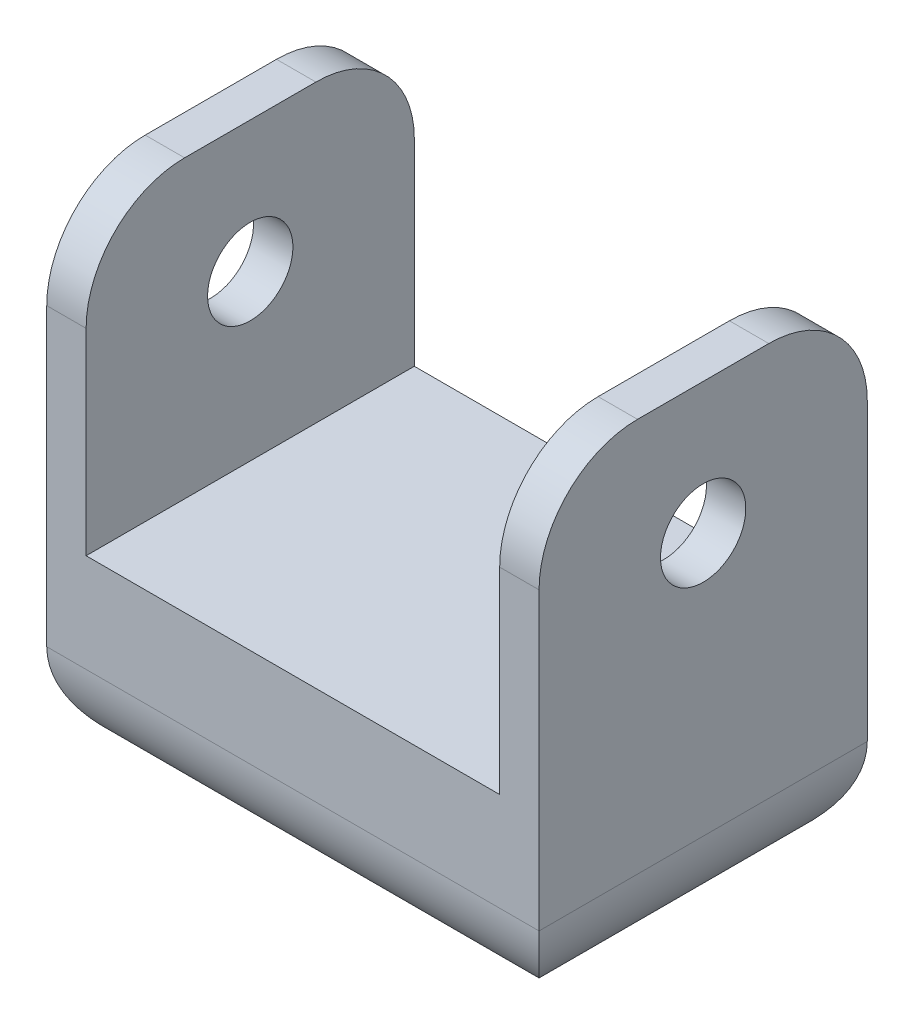
ISO-10303-21;
HEADER;
FILE_DESCRIPTION(('STEP AP214'),'2;1');
FILE_NAME('part.step','',(''),(''),'','','');
FILE_SCHEMA(('AUTOMOTIVE_DESIGN { 1 0 10303 214 1 1 1 1 }'));
ENDSEC;
DATA;
#1=APPLICATION_CONTEXT('core data for automotive mechanical design processes');
#2=APPLICATION_PROTOCOL_DEFINITION('international standard','automotive_design',2000,#1);
#3=PRODUCT_CONTEXT('',#1,'mechanical');
#4=PRODUCT('Part','Part','',(#3));
#5=PRODUCT_RELATED_PRODUCT_CATEGORY('part','',(#4));
#6=PRODUCT_DEFINITION_FORMATION('','',#4);
#7=PRODUCT_DEFINITION_CONTEXT('part definition',#1,'design');
#8=PRODUCT_DEFINITION('design','',#6,#7);
#9=PRODUCT_DEFINITION_SHAPE('','',#8);
#10=(LENGTH_UNIT() NAMED_UNIT(*) SI_UNIT(.MILLI.,.METRE.));
#11=(NAMED_UNIT(*) PLANE_ANGLE_UNIT() SI_UNIT($,.RADIAN.));
#12=(NAMED_UNIT(*) SI_UNIT($,.STERADIAN.) SOLID_ANGLE_UNIT());
#13=UNCERTAINTY_MEASURE_WITH_UNIT(LENGTH_MEASURE(1.E-05),#10,'distance_accuracy_value','');
#14=(GEOMETRIC_REPRESENTATION_CONTEXT(3) GLOBAL_UNCERTAINTY_ASSIGNED_CONTEXT((#13)) GLOBAL_UNIT_ASSIGNED_CONTEXT((#10,
#11,#12)) REPRESENTATION_CONTEXT('',''));
#15=CARTESIAN_POINT('',(0.,0.,0.));
#16=DIRECTION('',(0.,0.,1.));
#17=DIRECTION('',(1.,0.,0.));
#18=AXIS2_PLACEMENT_3D('',#15,#16,#17);
#19=CARTESIAN_POINT('',(0.,25.4,0.));
#20=DIRECTION('',(0.,1.,0.));
#21=DIRECTION('',(0.,0.,1.));
#22=AXIS2_PLACEMENT_3D('',#19,#20,#21);
#23=PLANE('',#22);
#24=DIRECTION('',(0.,0.,1.));
#25=VECTOR('',#24,1.);
#26=CARTESIAN_POINT('',(-19.05,25.4,-12.7));
#27=LINE('',#26,#25);
#28=CARTESIAN_POINT('',(-19.05,25.4,-5.08));
#29=VERTEX_POINT('',#28);
#30=CARTESIAN_POINT('',(-19.05,25.4,5.07999999999999));
#31=VERTEX_POINT('',#30);
#32=EDGE_CURVE('E187',#29,#31,#27,.T.);
#33=ORIENTED_EDGE('',*,*,#32,.T.);
#34=DIRECTION('',(1.,0.,0.));
#35=VECTOR('',#34,1.);
#36=CARTESIAN_POINT('',(-16.002,25.4,5.08));
#37=LINE('',#36,#35);
#38=CARTESIAN_POINT('',(-16.002,25.4,5.07999999999999));
#39=VERTEX_POINT('',#38);
#40=EDGE_CURVE('E227',#31,#39,#37,.T.);
#41=ORIENTED_EDGE('',*,*,#40,.T.);
#42=DIRECTION('',(0.,0.,1.));
#43=VECTOR('',#42,1.);
#44=CARTESIAN_POINT('',(-16.002,25.4,-12.7));
#45=LINE('',#44,#43);
#46=CARTESIAN_POINT('',(-16.002,25.4,-5.08));
#47=VERTEX_POINT('',#46);
#48=EDGE_CURVE('E173',#47,#39,#45,.T.);
#49=ORIENTED_EDGE('',*,*,#48,.F.);
#50=DIRECTION('',(-1.,0.,0.));
#51=VECTOR('',#50,1.);
#52=CARTESIAN_POINT('',(-19.05,25.4,-5.08));
#53=LINE('',#52,#51);
#54=EDGE_CURVE('E224',#47,#29,#53,.T.);
#55=ORIENTED_EDGE('',*,*,#54,.T.);
#56=EDGE_LOOP('',(#33,#41,#49,#55));
#57=FACE_BOUND('',#56,.T.);
#58=ADVANCED_FACE('F37',(#57),#23,.T.);
#59=CARTESIAN_POINT('',(19.05,25.4,-12.7));
#60=DIRECTION('',(-1.,0.,0.));
#61=DIRECTION('',(0.,0.,1.));
#62=AXIS2_PLACEMENT_3D('',#59,#60,#61);
#63=PLANE('',#62);
#64=CARTESIAN_POINT('',(19.05,15.24,0.));
#65=DIRECTION('',(-1.,0.,0.));
#66=DIRECTION('',(0.,0.,1.));
#67=AXIS2_PLACEMENT_3D('',#64,#65,#66);
#68=CIRCLE('',#67,3.302);
#69=CARTESIAN_POINT('',(19.05,15.24,3.30199999999999));
#70=VERTEX_POINT('',#69);
#71=EDGE_CURVE('E202',#70,#70,#68,.T.);
#72=ORIENTED_EDGE('',*,*,#71,.T.);
#73=EDGE_LOOP('',(#72));
#74=FACE_BOUND('',#73,.T.);
#75=DIRECTION('',(0.,-1.,0.));
#76=VECTOR('',#75,1.);
#77=CARTESIAN_POINT('',(19.05,25.4,12.7));
#78=LINE('',#77,#76);
#79=CARTESIAN_POINT('',(19.05,17.78,12.7));
#80=VERTEX_POINT('',#79);
#81=CARTESIAN_POINT('',(19.05,-5.08,12.7));
#82=VERTEX_POINT('',#81);
#83=EDGE_CURVE('E190',#80,#82,#78,.T.);
#84=ORIENTED_EDGE('',*,*,#83,.T.);
#85=DIRECTION('',(0.,0.,1.));
#86=VECTOR('',#85,1.);
#87=CARTESIAN_POINT('',(19.05,-5.08,-12.7));
#88=LINE('',#87,#86);
#89=CARTESIAN_POINT('',(19.05,-5.08,-12.7));
#90=VERTEX_POINT('',#89);
#91=EDGE_CURVE('E61',#82,#90,#88,.F.);
#92=ORIENTED_EDGE('',*,*,#91,.T.);
#93=DIRECTION('',(0.,-1.,0.));
#94=VECTOR('',#93,1.);
#95=CARTESIAN_POINT('',(19.05,25.4,-12.7));
#96=LINE('',#95,#94);
#97=CARTESIAN_POINT('',(19.05,17.78,-12.7));
#98=VERTEX_POINT('',#97);
#99=EDGE_CURVE('E196',#98,#90,#96,.T.);
#100=ORIENTED_EDGE('',*,*,#99,.F.);
#101=CARTESIAN_POINT('',(19.05,17.78,-5.08));
#102=DIRECTION('',(-1.,0.,0.));
#103=DIRECTION('',(0.,0.,1.));
#104=AXIS2_PLACEMENT_3D('',#101,#102,#103);
#105=CIRCLE('',#104,7.62);
#106=CARTESIAN_POINT('',(19.05,25.4,-5.08));
#107=VERTEX_POINT('',#106);
#108=EDGE_CURVE('E208',#98,#107,#105,.F.);
#109=ORIENTED_EDGE('',*,*,#108,.T.);
#110=DIRECTION('',(0.,0.,-1.));
#111=VECTOR('',#110,1.);
#112=CARTESIAN_POINT('',(19.05,25.4,-12.7));
#113=LINE('',#112,#111);
#114=CARTESIAN_POINT('',(19.05,25.4,5.07999999999999));
#115=VERTEX_POINT('',#114);
#116=EDGE_CURVE('E180',#115,#107,#113,.T.);
#117=ORIENTED_EDGE('',*,*,#116,.F.);
#118=CARTESIAN_POINT('',(19.05,17.78,5.08));
#119=DIRECTION('',(-1.,0.,0.));
#120=DIRECTION('',(0.,0.,1.));
#121=AXIS2_PLACEMENT_3D('',#118,#119,#120);
#122=CIRCLE('',#121,7.62);
#123=EDGE_CURVE('E210',#115,#80,#122,.F.);
#124=ORIENTED_EDGE('',*,*,#123,.T.);
#125=EDGE_LOOP('',(#84,#92,#100,#109,#117,#124));
#126=FACE_BOUND('',#125,.T.);
#127=ADVANCED_FACE('F291',(#74,#126),#63,.F.);
#128=CARTESIAN_POINT('',(-19.05,25.4,-12.7));
#129=DIRECTION('',(0.,0.,1.));
#130=DIRECTION('',(1.,0.,0.));
#131=AXIS2_PLACEMENT_3D('',#128,#129,#130);
#132=PLANE('',#131);
#133=ORIENTED_EDGE('',*,*,#99,.T.);
#134=DIRECTION('',(1.,0.,0.));
#135=VECTOR('',#134,1.);
#136=CARTESIAN_POINT('',(-19.05,-5.08,-12.7));
#137=LINE('',#136,#135);
#138=CARTESIAN_POINT('',(-19.05,-5.08,-12.7));
#139=VERTEX_POINT('',#138);
#140=EDGE_CURVE('E46',#90,#139,#137,.F.);
#141=ORIENTED_EDGE('',*,*,#140,.T.);
#142=DIRECTION('',(0.,-1.,0.));
#143=VECTOR('',#142,1.);
#144=CARTESIAN_POINT('',(-19.05,25.4,-12.7));
#145=LINE('',#144,#143);
#146=CARTESIAN_POINT('',(-19.05,17.78,-12.7));
#147=VERTEX_POINT('',#146);
#148=EDGE_CURVE('E194',#147,#139,#145,.T.);
#149=ORIENTED_EDGE('',*,*,#148,.F.);
#150=DIRECTION('',(-1.,0.,0.));
#151=VECTOR('',#150,1.);
#152=CARTESIAN_POINT('',(-16.002,17.78,-12.7));
#153=LINE('',#152,#151);
#154=CARTESIAN_POINT('',(-16.002,17.78,-12.7));
#155=VERTEX_POINT('',#154);
#156=EDGE_CURVE('E220',#147,#155,#153,.F.);
#157=ORIENTED_EDGE('',*,*,#156,.T.);
#158=DIRECTION('',(0.,1.,0.));
#159=VECTOR('',#158,1.);
#160=CARTESIAN_POINT('',(-16.002,2.54,-12.7));
#161=LINE('',#160,#159);
#162=CARTESIAN_POINT('',(-16.002,2.54,-12.7));
#163=VERTEX_POINT('',#162);
#164=EDGE_CURVE('E178',#163,#155,#161,.T.);
#165=ORIENTED_EDGE('',*,*,#164,.F.);
#166=DIRECTION('',(-1.,0.,0.));
#167=VECTOR('',#166,1.);
#168=CARTESIAN_POINT('',(-16.002,2.54,-12.7));
#169=LINE('',#168,#167);
#170=CARTESIAN_POINT('',(16.002,2.54,-12.7));
#171=VERTEX_POINT('',#170);
#172=EDGE_CURVE('E152',#171,#163,#169,.T.);
#173=ORIENTED_EDGE('',*,*,#172,.F.);
#174=DIRECTION('',(0.,1.,0.));
#175=VECTOR('',#174,1.);
#176=CARTESIAN_POINT('',(16.002,2.54,-12.7));
#177=LINE('',#176,#175);
#178=CARTESIAN_POINT('',(16.002,17.78,-12.7));
#179=VERTEX_POINT('',#178);
#180=EDGE_CURVE('E181',#171,#179,#177,.T.);
#181=ORIENTED_EDGE('',*,*,#180,.T.);
#182=DIRECTION('',(-1.,0.,0.));
#183=VECTOR('',#182,1.);
#184=CARTESIAN_POINT('',(19.05,17.78,-12.7));
#185=LINE('',#184,#183);
#186=EDGE_CURVE('E222',#179,#98,#185,.F.);
#187=ORIENTED_EDGE('',*,*,#186,.T.);
#188=EDGE_LOOP('',(#133,#141,#149,#157,#165,#173,#181,#187));
#189=FACE_BOUND('',#188,.T.);
#190=ADVANCED_FACE('F298',(#189),#132,.F.);
#191=CARTESIAN_POINT('',(-19.05,25.4,-12.7));
#192=DIRECTION('',(1.,0.,0.));
#193=DIRECTION('',(0.,0.,-1.));
#194=AXIS2_PLACEMENT_3D('',#191,#192,#193);
#195=PLANE('',#194);
#196=CARTESIAN_POINT('',(-19.05,15.24,0.));
#197=DIRECTION('',(-1.,0.,0.));
#198=DIRECTION('',(0.,0.,1.));
#199=AXIS2_PLACEMENT_3D('',#196,#197,#198);
#200=CIRCLE('',#199,3.302);
#201=CARTESIAN_POINT('',(-19.05,15.24,3.302));
#202=VERTEX_POINT('',#201);
#203=EDGE_CURVE('E261',#202,#202,#200,.T.);
#204=ORIENTED_EDGE('',*,*,#203,.F.);
#205=EDGE_LOOP('',(#204));
#206=FACE_BOUND('',#205,.T.);
#207=ORIENTED_EDGE('',*,*,#148,.T.);
#208=DIRECTION('',(0.,0.,-1.));
#209=VECTOR('',#208,1.);
#210=CARTESIAN_POINT('',(-19.05,-5.08,12.7));
#211=LINE('',#210,#209);
#212=CARTESIAN_POINT('',(-19.05,-5.08,12.7));
#213=VERTEX_POINT('',#212);
#214=EDGE_CURVE('E11',#139,#213,#211,.F.);
#215=ORIENTED_EDGE('',*,*,#214,.T.);
#216=DIRECTION('',(0.,-1.,0.));
#217=VECTOR('',#216,1.);
#218=CARTESIAN_POINT('',(-19.05,25.4,12.7));
#219=LINE('',#218,#217);
#220=CARTESIAN_POINT('',(-19.05,17.78,12.7));
#221=VERTEX_POINT('',#220);
#222=EDGE_CURVE('E192',#221,#213,#219,.T.);
#223=ORIENTED_EDGE('',*,*,#222,.F.);
#224=CARTESIAN_POINT('',(-19.05,17.78,5.08));
#225=DIRECTION('',(1.,0.,0.));
#226=DIRECTION('',(0.,0.,-1.));
#227=AXIS2_PLACEMENT_3D('',#224,#225,#226);
#228=CIRCLE('',#227,7.62);
#229=EDGE_CURVE('E235',#221,#31,#228,.F.);
#230=ORIENTED_EDGE('',*,*,#229,.T.);
#231=ORIENTED_EDGE('',*,*,#32,.F.);
#232=CARTESIAN_POINT('',(-19.05,17.78,-5.08));
#233=DIRECTION('',(1.,0.,0.));
#234=DIRECTION('',(0.,0.,-1.));
#235=AXIS2_PLACEMENT_3D('',#232,#233,#234);
#236=CIRCLE('',#235,7.62);
#237=EDGE_CURVE('E233',#29,#147,#236,.F.);
#238=ORIENTED_EDGE('',*,*,#237,.T.);
#239=EDGE_LOOP('',(#207,#215,#223,#230,#231,#238));
#240=FACE_BOUND('',#239,.T.);
#241=ADVANCED_FACE('F310',(#206,#240),#195,.F.);
#242=CARTESIAN_POINT('',(-19.05,25.4,12.7));
#243=DIRECTION('',(0.,0.,-1.));
#244=DIRECTION('',(-1.,0.,0.));
#245=AXIS2_PLACEMENT_3D('',#242,#243,#244);
#246=PLANE('',#245);
#247=ORIENTED_EDGE('',*,*,#222,.T.);
#248=DIRECTION('',(-1.,0.,0.));
#249=VECTOR('',#248,1.);
#250=CARTESIAN_POINT('',(19.05,-5.08,12.7));
#251=LINE('',#250,#249);
#252=EDGE_CURVE('E246',#213,#82,#251,.F.);
#253=ORIENTED_EDGE('',*,*,#252,.T.);
#254=ORIENTED_EDGE('',*,*,#83,.F.);
#255=DIRECTION('',(1.,0.,0.));
#256=VECTOR('',#255,1.);
#257=CARTESIAN_POINT('',(16.002,17.78,12.7));
#258=LINE('',#257,#256);
#259=CARTESIAN_POINT('',(16.002,17.78,12.7));
#260=VERTEX_POINT('',#259);
#261=EDGE_CURVE('E214',#80,#260,#258,.F.);
#262=ORIENTED_EDGE('',*,*,#261,.T.);
#263=DIRECTION('',(0.,1.,0.));
#264=VECTOR('',#263,1.);
#265=CARTESIAN_POINT('',(16.002,2.54,12.7));
#266=LINE('',#265,#264);
#267=CARTESIAN_POINT('',(16.002,2.54,12.7));
#268=VERTEX_POINT('',#267);
#269=EDGE_CURVE('E151',#268,#260,#266,.T.);
#270=ORIENTED_EDGE('',*,*,#269,.F.);
#271=DIRECTION('',(1.,0.,0.));
#272=VECTOR('',#271,1.);
#273=CARTESIAN_POINT('',(-16.002,2.54,12.7));
#274=LINE('',#273,#272);
#275=CARTESIAN_POINT('',(-16.002,2.54,12.7));
#276=VERTEX_POINT('',#275);
#277=EDGE_CURVE('E158',#276,#268,#274,.T.);
#278=ORIENTED_EDGE('',*,*,#277,.F.);
#279=DIRECTION('',(0.,1.,0.));
#280=VECTOR('',#279,1.);
#281=CARTESIAN_POINT('',(-16.002,2.54,12.7));
#282=LINE('',#281,#280);
#283=CARTESIAN_POINT('',(-16.002,17.78,12.7));
#284=VERTEX_POINT('',#283);
#285=EDGE_CURVE('E140',#276,#284,#282,.T.);
#286=ORIENTED_EDGE('',*,*,#285,.T.);
#287=DIRECTION('',(1.,0.,0.));
#288=VECTOR('',#287,1.);
#289=CARTESIAN_POINT('',(-19.05,17.78,12.7));
#290=LINE('',#289,#288);
#291=EDGE_CURVE('E212',#284,#221,#290,.F.);
#292=ORIENTED_EDGE('',*,*,#291,.T.);
#293=EDGE_LOOP('',(#247,#253,#254,#262,#270,#278,#286,#292));
#294=FACE_BOUND('',#293,.T.);
#295=ADVANCED_FACE('F165',(#294),#246,.F.);
#296=DIRECTION('',(0.,0.,-1.));
#297=VECTOR('',#296,1.);
#298=CARTESIAN_POINT('',(16.002,25.4,-12.7));
#299=LINE('',#298,#297);
#300=CARTESIAN_POINT('',(16.002,25.4,5.07999999999999));
#301=VERTEX_POINT('',#300);
#302=CARTESIAN_POINT('',(16.002,25.4,-5.08));
#303=VERTEX_POINT('',#302);
#304=EDGE_CURVE('E162',#301,#303,#299,.T.);
#305=ORIENTED_EDGE('',*,*,#304,.F.);
#306=DIRECTION('',(1.,0.,0.));
#307=VECTOR('',#306,1.);
#308=CARTESIAN_POINT('',(19.05,25.4,5.08));
#309=LINE('',#308,#307);
#310=EDGE_CURVE('E205',#301,#115,#309,.T.);
#311=ORIENTED_EDGE('',*,*,#310,.T.);
#312=ORIENTED_EDGE('',*,*,#116,.T.);
#313=DIRECTION('',(-1.,0.,0.));
#314=VECTOR('',#313,1.);
#315=CARTESIAN_POINT('',(16.002,25.4,-5.08));
#316=LINE('',#315,#314);
#317=EDGE_CURVE('E198',#107,#303,#316,.T.);
#318=ORIENTED_EDGE('',*,*,#317,.T.);
#319=EDGE_LOOP('',(#305,#311,#312,#318));
#320=FACE_BOUND('',#319,.T.);
#321=ADVANCED_FACE('F294',(#320),#23,.T.);
#322=CARTESIAN_POINT('',(-16.002,2.54,-12.7));
#323=DIRECTION('',(-1.,0.,0.));
#324=DIRECTION('',(0.,0.,1.));
#325=AXIS2_PLACEMENT_3D('',#322,#323,#324);
#326=PLANE('',#325);
#327=CARTESIAN_POINT('',(-16.002,15.24,0.));
#328=DIRECTION('',(-1.,0.,0.));
#329=DIRECTION('',(0.,0.,1.));
#330=AXIS2_PLACEMENT_3D('',#327,#328,#329);
#331=CIRCLE('',#330,3.302);
#332=CARTESIAN_POINT('',(-16.002,15.24,3.302));
#333=VERTEX_POINT('',#332);
#334=EDGE_CURVE('E175',#333,#333,#331,.T.);
#335=ORIENTED_EDGE('',*,*,#334,.T.);
#336=EDGE_LOOP('',(#335));
#337=FACE_BOUND('',#336,.T.);
#338=ORIENTED_EDGE('',*,*,#48,.T.);
#339=CARTESIAN_POINT('',(-16.002,17.78,5.08));
#340=DIRECTION('',(-1.,0.,0.));
#341=DIRECTION('',(0.,0.,1.));
#342=AXIS2_PLACEMENT_3D('',#339,#340,#341);
#343=CIRCLE('',#342,7.62);
#344=EDGE_CURVE('E147',#39,#284,#343,.F.);
#345=ORIENTED_EDGE('',*,*,#344,.T.);
#346=ORIENTED_EDGE('',*,*,#285,.F.);
#347=DIRECTION('',(0.,0.,1.));
#348=VECTOR('',#347,1.);
#349=CARTESIAN_POINT('',(-16.002,2.54,-12.7));
#350=LINE('',#349,#348);
#351=EDGE_CURVE('E145',#163,#276,#350,.T.);
#352=ORIENTED_EDGE('',*,*,#351,.F.);
#353=ORIENTED_EDGE('',*,*,#164,.T.);
#354=CARTESIAN_POINT('',(-16.002,17.78,-5.08));
#355=DIRECTION('',(-1.,0.,0.));
#356=DIRECTION('',(0.,0.,1.));
#357=AXIS2_PLACEMENT_3D('',#354,#355,#356);
#358=CIRCLE('',#357,7.62);
#359=EDGE_CURVE('E230',#155,#47,#358,.F.);
#360=ORIENTED_EDGE('',*,*,#359,.T.);
#361=EDGE_LOOP('',(#338,#345,#346,#352,#353,#360));
#362=FACE_BOUND('',#361,.T.);
#363=ADVANCED_FACE('F143',(#337,#362),#326,.F.);
#364=CARTESIAN_POINT('',(16.002,2.54,-12.7));
#365=DIRECTION('',(1.,0.,0.));
#366=DIRECTION('',(0.,0.,-1.));
#367=AXIS2_PLACEMENT_3D('',#364,#365,#366);
#368=PLANE('',#367);
#369=CARTESIAN_POINT('',(16.002,15.24,0.));
#370=DIRECTION('',(1.,0.,0.));
#371=DIRECTION('',(0.,0.,-1.));
#372=AXIS2_PLACEMENT_3D('',#369,#370,#371);
#373=CIRCLE('',#372,3.302);
#374=CARTESIAN_POINT('',(16.002,15.24,-3.302));
#375=VERTEX_POINT('',#374);
#376=EDGE_CURVE('E199',#375,#375,#373,.T.);
#377=ORIENTED_EDGE('',*,*,#376,.T.);
#378=EDGE_LOOP('',(#377));
#379=FACE_BOUND('',#378,.T.);
#380=ORIENTED_EDGE('',*,*,#269,.T.);
#381=CARTESIAN_POINT('',(16.002,17.78,5.08));
#382=DIRECTION('',(1.,0.,0.));
#383=DIRECTION('',(0.,0.,-1.));
#384=AXIS2_PLACEMENT_3D('',#381,#382,#383);
#385=CIRCLE('',#384,7.62);
#386=EDGE_CURVE('E218',#260,#301,#385,.F.);
#387=ORIENTED_EDGE('',*,*,#386,.T.);
#388=ORIENTED_EDGE('',*,*,#304,.T.);
#389=CARTESIAN_POINT('',(16.002,17.78,-5.08));
#390=DIRECTION('',(1.,0.,0.));
#391=DIRECTION('',(0.,0.,-1.));
#392=AXIS2_PLACEMENT_3D('',#389,#390,#391);
#393=CIRCLE('',#392,7.62);
#394=EDGE_CURVE('E216',#303,#179,#393,.F.);
#395=ORIENTED_EDGE('',*,*,#394,.T.);
#396=ORIENTED_EDGE('',*,*,#180,.F.);
#397=DIRECTION('',(0.,0.,-1.));
#398=VECTOR('',#397,1.);
#399=CARTESIAN_POINT('',(16.002,2.54,-12.7));
#400=LINE('',#399,#398);
#401=EDGE_CURVE('E167',#268,#171,#400,.T.);
#402=ORIENTED_EDGE('',*,*,#401,.F.);
#403=EDGE_LOOP('',(#380,#387,#388,#395,#396,#402));
#404=FACE_BOUND('',#403,.T.);
#405=ADVANCED_FACE('F309',(#379,#404),#368,.F.);
#406=CARTESIAN_POINT('',(0.,2.54,0.));
#407=DIRECTION('',(0.,1.,0.));
#408=DIRECTION('',(0.,0.,1.));
#409=AXIS2_PLACEMENT_3D('',#406,#407,#408);
#410=PLANE('',#409);
#411=ORIENTED_EDGE('',*,*,#351,.T.);
#412=ORIENTED_EDGE('',*,*,#277,.T.);
#413=ORIENTED_EDGE('',*,*,#401,.T.);
#414=ORIENTED_EDGE('',*,*,#172,.T.);
#415=EDGE_LOOP('',(#411,#412,#413,#414));
#416=FACE_BOUND('',#415,.T.);
#417=ADVANCED_FACE('F156',(#416),#410,.T.);
#418=CARTESIAN_POINT('',(19.05,15.24,0.));
#419=DIRECTION('',(-1.,0.,0.));
#420=DIRECTION('',(0.,0.,1.));
#421=AXIS2_PLACEMENT_3D('',#418,#419,#420);
#422=CYLINDRICAL_SURFACE('',#421,3.302);
#423=ORIENTED_EDGE('',*,*,#71,.F.);
#424=EDGE_LOOP('',(#423));
#425=FACE_BOUND('',#424,.T.);
#426=ORIENTED_EDGE('',*,*,#376,.F.);
#427=EDGE_LOOP('',(#426));
#428=FACE_BOUND('',#427,.T.);
#429=ADVANCED_FACE('F278',(#425,#428),#422,.F.);
#430=ORIENTED_EDGE('',*,*,#203,.T.);
#431=EDGE_LOOP('',(#430));
#432=FACE_BOUND('',#431,.T.);
#433=ORIENTED_EDGE('',*,*,#334,.F.);
#434=EDGE_LOOP('',(#433));
#435=FACE_BOUND('',#434,.T.);
#436=ADVANCED_FACE('F275',(#432,#435),#422,.F.);
#437=CARTESIAN_POINT('',(0.,17.78,5.08));
#438=DIRECTION('',(-1.,0.,0.));
#439=DIRECTION('',(0.,0.,1.));
#440=AXIS2_PLACEMENT_3D('',#437,#438,#439);
#441=CYLINDRICAL_SURFACE('',#440,7.62);
#442=ORIENTED_EDGE('',*,*,#386,.F.);
#443=ORIENTED_EDGE('',*,*,#261,.F.);
#444=ORIENTED_EDGE('',*,*,#123,.F.);
#445=ORIENTED_EDGE('',*,*,#310,.F.);
#446=EDGE_LOOP('',(#442,#443,#444,#445));
#447=FACE_BOUND('',#446,.T.);
#448=ADVANCED_FACE('F277',(#447),#441,.T.);
#449=CARTESIAN_POINT('',(0.,17.78,-5.08));
#450=DIRECTION('',(1.,0.,0.));
#451=DIRECTION('',(0.,0.,-1.));
#452=AXIS2_PLACEMENT_3D('',#449,#450,#451);
#453=CYLINDRICAL_SURFACE('',#452,7.62);
#454=ORIENTED_EDGE('',*,*,#108,.F.);
#455=ORIENTED_EDGE('',*,*,#186,.F.);
#456=ORIENTED_EDGE('',*,*,#394,.F.);
#457=ORIENTED_EDGE('',*,*,#317,.F.);
#458=EDGE_LOOP('',(#454,#455,#456,#457));
#459=FACE_BOUND('',#458,.T.);
#460=ADVANCED_FACE('F284',(#459),#453,.T.);
#461=CARTESIAN_POINT('',(0.,17.78,5.08));
#462=DIRECTION('',(-1.,0.,0.));
#463=DIRECTION('',(0.,0.,1.));
#464=AXIS2_PLACEMENT_3D('',#461,#462,#463);
#465=CYLINDRICAL_SURFACE('',#464,7.62);
#466=ORIENTED_EDGE('',*,*,#229,.F.);
#467=ORIENTED_EDGE('',*,*,#291,.F.);
#468=ORIENTED_EDGE('',*,*,#344,.F.);
#469=ORIENTED_EDGE('',*,*,#40,.F.);
#470=EDGE_LOOP('',(#466,#467,#468,#469));
#471=FACE_BOUND('',#470,.T.);
#472=ADVANCED_FACE('F344',(#471),#465,.T.);
#473=CARTESIAN_POINT('',(0.,17.78,-5.08));
#474=DIRECTION('',(1.,0.,0.));
#475=DIRECTION('',(0.,0.,-1.));
#476=AXIS2_PLACEMENT_3D('',#473,#474,#475);
#477=CYLINDRICAL_SURFACE('',#476,7.62);
#478=ORIENTED_EDGE('',*,*,#359,.F.);
#479=ORIENTED_EDGE('',*,*,#156,.F.);
#480=ORIENTED_EDGE('',*,*,#237,.F.);
#481=ORIENTED_EDGE('',*,*,#54,.F.);
#482=EDGE_LOOP('',(#478,#479,#480,#481));
#483=FACE_BOUND('',#482,.T.);
#484=ADVANCED_FACE('F341',(#483),#477,.T.);
#485=CARTESIAN_POINT('',(0.,-12.7,0.));
#486=DIRECTION('',(0.,-1.,0.));
#487=DIRECTION('',(0.,0.,-1.));
#488=AXIS2_PLACEMENT_3D('',#485,#486,#487);
#489=PLANE('',#488);
#490=DIRECTION('',(0.,0.,1.));
#491=VECTOR('',#490,1.);
#492=CARTESIAN_POINT('',(11.43,-12.7,12.7));
#493=LINE('',#492,#491);
#494=CARTESIAN_POINT('',(11.43,-12.7,-5.08));
#495=VERTEX_POINT('',#494);
#496=CARTESIAN_POINT('',(11.43,-12.7,5.08));
#497=VERTEX_POINT('',#496);
#498=EDGE_CURVE('E241',#495,#497,#493,.T.);
#499=ORIENTED_EDGE('',*,*,#498,.T.);
#500=DIRECTION('',(-1.,0.,0.));
#501=VECTOR('',#500,1.);
#502=CARTESIAN_POINT('',(-19.05,-12.7,5.08));
#503=LINE('',#502,#501);
#504=CARTESIAN_POINT('',(-11.43,-12.7,5.08));
#505=VERTEX_POINT('',#504);
#506=EDGE_CURVE('E243',#497,#505,#503,.T.);
#507=ORIENTED_EDGE('',*,*,#506,.T.);
#508=DIRECTION('',(0.,0.,-1.));
#509=VECTOR('',#508,1.);
#510=CARTESIAN_POINT('',(-11.43,-12.7,-12.7));
#511=LINE('',#510,#509);
#512=CARTESIAN_POINT('',(-11.43,-12.7,-5.08));
#513=VERTEX_POINT('',#512);
#514=EDGE_CURVE('E237',#505,#513,#511,.T.);
#515=ORIENTED_EDGE('',*,*,#514,.T.);
#516=DIRECTION('',(1.,0.,0.));
#517=VECTOR('',#516,1.);
#518=CARTESIAN_POINT('',(19.05,-12.7,-5.08));
#519=LINE('',#518,#517);
#520=EDGE_CURVE('E239',#513,#495,#519,.T.);
#521=ORIENTED_EDGE('',*,*,#520,.T.);
#522=EDGE_LOOP('',(#499,#507,#515,#521));
#523=FACE_BOUND('',#522,.T.);
#524=ADVANCED_FACE('F329',(#523),#489,.T.);
#525=CARTESIAN_POINT('',(0.,-5.08,-5.08));
#526=DIRECTION('',(-1.,0.,0.));
#527=DIRECTION('',(0.,0.,1.));
#528=AXIS2_PLACEMENT_3D('',#525,#526,#527);
#529=CYLINDRICAL_SURFACE('',#528,7.62);
#530=CARTESIAN_POINT('',(-11.43,-5.08,-5.08));
#531=DIRECTION('',(-0.707106781186547,0.,0.707106781186548));
#532=DIRECTION('',(0.707106781186548,0.,0.707106781186547));
#533=AXIS2_PLACEMENT_3D('',#530,#531,#532);
#534=ELLIPSE('',#533,10.776307345283,7.62);
#535=EDGE_CURVE('E254',#139,#513,#534,.T.);
#536=ORIENTED_EDGE('',*,*,#535,.F.);
#537=ORIENTED_EDGE('',*,*,#140,.F.);
#538=CARTESIAN_POINT('',(11.43,-5.08,-5.08));
#539=DIRECTION('',(-0.707106781186548,0.,-0.707106781186547));
#540=DIRECTION('',(-0.707106781186547,0.,0.707106781186548));
#541=AXIS2_PLACEMENT_3D('',#538,#539,#540);
#542=ELLIPSE('',#541,10.776307345283,7.62);
#543=EDGE_CURVE('E41',#495,#90,#542,.F.);
#544=ORIENTED_EDGE('',*,*,#543,.F.);
#545=ORIENTED_EDGE('',*,*,#520,.F.);
#546=EDGE_LOOP('',(#536,#537,#544,#545));
#547=FACE_BOUND('',#546,.T.);
#548=ADVANCED_FACE('F39',(#547),#529,.T.);
#549=CARTESIAN_POINT('',(11.43,-5.08,0.));
#550=DIRECTION('',(0.,0.,-1.));
#551=DIRECTION('',(-1.,0.,0.));
#552=AXIS2_PLACEMENT_3D('',#549,#550,#551);
#553=CYLINDRICAL_SURFACE('',#552,7.62);
#554=ORIENTED_EDGE('',*,*,#543,.T.);
#555=ORIENTED_EDGE('',*,*,#91,.F.);
#556=CARTESIAN_POINT('',(11.43,-5.08,5.08));
#557=DIRECTION('',(0.707106781186547,0.,-0.707106781186548));
#558=DIRECTION('',(-0.707106781186548,0.,-0.707106781186547));
#559=AXIS2_PLACEMENT_3D('',#556,#557,#558);
#560=ELLIPSE('',#559,10.776307345283,7.62);
#561=EDGE_CURVE('E253',#497,#82,#560,.F.);
#562=ORIENTED_EDGE('',*,*,#561,.F.);
#563=ORIENTED_EDGE('',*,*,#498,.F.);
#564=EDGE_LOOP('',(#554,#555,#562,#563));
#565=FACE_BOUND('',#564,.T.);
#566=ADVANCED_FACE('F330',(#565),#553,.T.);
#567=CARTESIAN_POINT('',(-11.43,-5.08,0.));
#568=DIRECTION('',(0.,0.,1.));
#569=DIRECTION('',(1.,0.,0.));
#570=AXIS2_PLACEMENT_3D('',#567,#568,#569);
#571=CYLINDRICAL_SURFACE('',#570,7.62);
#572=ORIENTED_EDGE('',*,*,#535,.T.);
#573=ORIENTED_EDGE('',*,*,#514,.F.);
#574=CARTESIAN_POINT('',(-11.43,-5.08,5.08));
#575=DIRECTION('',(0.707106781186548,0.,0.707106781186547));
#576=DIRECTION('',(-0.707106781186547,0.,0.707106781186548));
#577=AXIS2_PLACEMENT_3D('',#574,#575,#576);
#578=ELLIPSE('',#577,10.776307345283,7.62);
#579=EDGE_CURVE('E251',#213,#505,#578,.T.);
#580=ORIENTED_EDGE('',*,*,#579,.F.);
#581=ORIENTED_EDGE('',*,*,#214,.F.);
#582=EDGE_LOOP('',(#572,#573,#580,#581));
#583=FACE_BOUND('',#582,.T.);
#584=ADVANCED_FACE('F326',(#583),#571,.T.);
#585=CARTESIAN_POINT('',(0.,-5.08,5.08));
#586=DIRECTION('',(1.,0.,0.));
#587=DIRECTION('',(0.,0.,-1.));
#588=AXIS2_PLACEMENT_3D('',#585,#586,#587);
#589=CYLINDRICAL_SURFACE('',#588,7.62);
#590=ORIENTED_EDGE('',*,*,#561,.T.);
#591=ORIENTED_EDGE('',*,*,#252,.F.);
#592=ORIENTED_EDGE('',*,*,#579,.T.);
#593=ORIENTED_EDGE('',*,*,#506,.F.);
#594=EDGE_LOOP('',(#590,#591,#592,#593));
#595=FACE_BOUND('',#594,.T.);
#596=ADVANCED_FACE('F323',(#595),#589,.T.);
#597=CLOSED_SHELL('',(#58,#127,#190,#241,#295,#321,#363,#405,#417,#429,#436,#448,#460,#472,#484,
#524,#548,#566,#584,#596));
#598=MANIFOLD_SOLID_BREP('B2',#597);
#599=ADVANCED_BREP_SHAPE_REPRESENTATION('',(#18,#598),#14);
#600=SHAPE_DEFINITION_REPRESENTATION(#9,#599);
ENDSEC;
END-ISO-10303-21;
